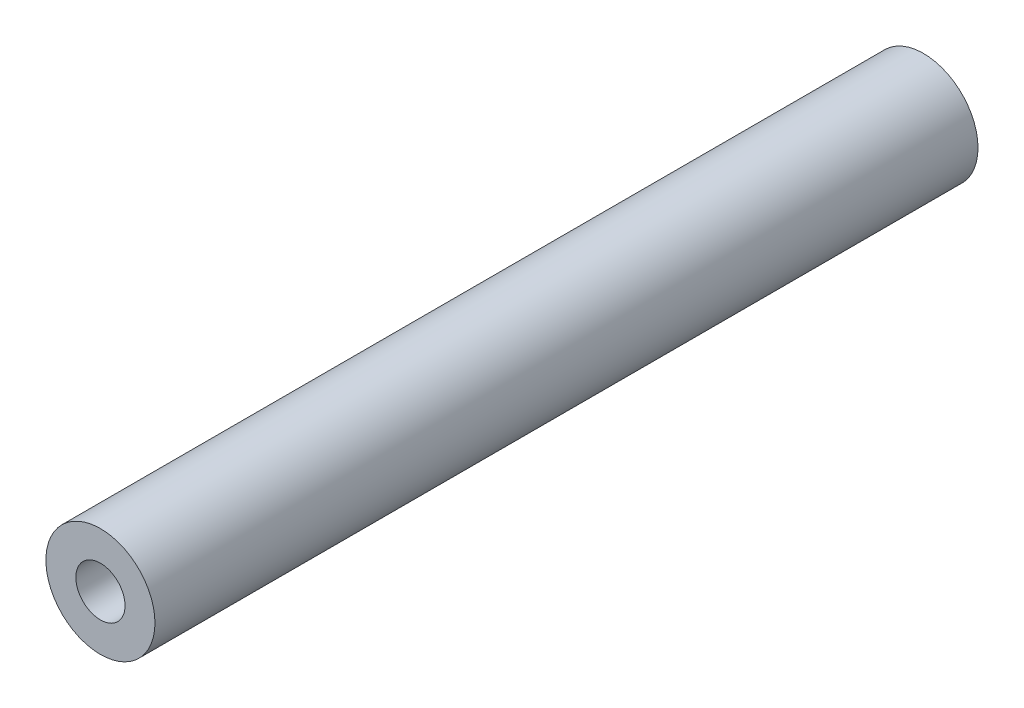
ISO-10303-21;
HEADER;
FILE_DESCRIPTION(('STEP AP214'),'2;1');
FILE_NAME('part.step','',(''),(''),'','','');
FILE_SCHEMA(('AUTOMOTIVE_DESIGN { 1 0 10303 214 1 1 1 1 }'));
ENDSEC;
DATA;
#1=APPLICATION_CONTEXT('core data for automotive mechanical design processes');
#2=APPLICATION_PROTOCOL_DEFINITION('international standard','automotive_design',2000,#1);
#3=PRODUCT_CONTEXT('',#1,'mechanical');
#4=PRODUCT('Part','Part','',(#3));
#5=PRODUCT_RELATED_PRODUCT_CATEGORY('part','',(#4));
#6=PRODUCT_DEFINITION_FORMATION('','',#4);
#7=PRODUCT_DEFINITION_CONTEXT('part definition',#1,'design');
#8=PRODUCT_DEFINITION('design','',#6,#7);
#9=PRODUCT_DEFINITION_SHAPE('','',#8);
#10=(LENGTH_UNIT() NAMED_UNIT(*) SI_UNIT(.MILLI.,.METRE.));
#11=(NAMED_UNIT(*) PLANE_ANGLE_UNIT() SI_UNIT($,.RADIAN.));
#12=(NAMED_UNIT(*) SI_UNIT($,.STERADIAN.) SOLID_ANGLE_UNIT());
#13=UNCERTAINTY_MEASURE_WITH_UNIT(LENGTH_MEASURE(1.E-05),#10,'distance_accuracy_value','');
#14=(GEOMETRIC_REPRESENTATION_CONTEXT(3) GLOBAL_UNCERTAINTY_ASSIGNED_CONTEXT((#13)) GLOBAL_UNIT_ASSIGNED_CONTEXT((#10,
#11,#12)) REPRESENTATION_CONTEXT('',''));
#15=CARTESIAN_POINT('',(0.,0.,0.));
#16=DIRECTION('',(0.,0.,1.));
#17=DIRECTION('',(1.,0.,0.));
#18=AXIS2_PLACEMENT_3D('',#15,#16,#17);
#19=CARTESIAN_POINT('',(0.,0.,45.28));
#20=DIRECTION('',(0.,0.,-1.));
#21=DIRECTION('',(-1.,0.,0.));
#22=AXIS2_PLACEMENT_3D('',#19,#20,#21);
#23=CYLINDRICAL_SURFACE('',#22,3.);
#24=CARTESIAN_POINT('',(0.,0.,45.28));
#25=DIRECTION('',(0.,0.,1.));
#26=DIRECTION('',(1.,0.,0.));
#27=AXIS2_PLACEMENT_3D('',#24,#25,#26);
#28=CIRCLE('',#27,3.);
#29=CARTESIAN_POINT('',(3.,0.,45.28));
#30=VERTEX_POINT('',#29);
#31=EDGE_CURVE('E11',#30,#30,#28,.T.);
#32=ORIENTED_EDGE('',*,*,#31,.F.);
#33=EDGE_LOOP('',(#32));
#34=FACE_BOUND('',#33,.T.);
#35=CARTESIAN_POINT('',(0.,0.,0.));
#36=DIRECTION('',(0.,0.,1.));
#37=DIRECTION('',(1.,0.,0.));
#38=AXIS2_PLACEMENT_3D('',#35,#36,#37);
#39=CIRCLE('',#38,3.);
#40=CARTESIAN_POINT('',(3.,0.,0.));
#41=VERTEX_POINT('',#40);
#42=EDGE_CURVE('E39',#41,#41,#39,.T.);
#43=ORIENTED_EDGE('',*,*,#42,.T.);
#44=EDGE_LOOP('',(#43));
#45=FACE_BOUND('',#44,.T.);
#46=ADVANCED_FACE('F36',(#34,#45),#23,.T.);
#47=CARTESIAN_POINT('',(0.,0.,45.28));
#48=DIRECTION('',(0.,0.,1.));
#49=DIRECTION('',(1.,0.,0.));
#50=AXIS2_PLACEMENT_3D('',#47,#48,#49);
#51=PLANE('',#50);
#52=CARTESIAN_POINT('',(0.,0.,45.28));
#53=DIRECTION('',(0.,0.,1.));
#54=DIRECTION('',(1.,0.,0.));
#55=AXIS2_PLACEMENT_3D('',#52,#53,#54);
#56=CIRCLE('',#55,1.35254999999999);
#57=CARTESIAN_POINT('',(1.35254999999999,0.,45.28));
#58=VERTEX_POINT('',#57);
#59=EDGE_CURVE('E59',#58,#58,#56,.T.);
#60=ORIENTED_EDGE('',*,*,#59,.F.);
#61=EDGE_LOOP('',(#60));
#62=FACE_BOUND('',#61,.T.);
#63=ORIENTED_EDGE('',*,*,#31,.T.);
#64=EDGE_LOOP('',(#63));
#65=FACE_BOUND('',#64,.T.);
#66=ADVANCED_FACE('F78',(#62,#65),#51,.T.);
#67=CARTESIAN_POINT('',(0.,0.,0.));
#68=DIRECTION('',(0.,0.,1.));
#69=DIRECTION('',(1.,0.,0.));
#70=AXIS2_PLACEMENT_3D('',#67,#68,#69);
#71=PLANE('',#70);
#72=CARTESIAN_POINT('',(0.,0.,0.));
#73=DIRECTION('',(0.,0.,-1.));
#74=DIRECTION('',(-1.,0.,0.));
#75=AXIS2_PLACEMENT_3D('',#72,#73,#74);
#76=CIRCLE('',#75,1.35254999999999);
#77=CARTESIAN_POINT('',(-1.35254999999999,0.,0.));
#78=VERTEX_POINT('',#77);
#79=EDGE_CURVE('E60',#78,#78,#76,.T.);
#80=ORIENTED_EDGE('',*,*,#79,.F.);
#81=EDGE_LOOP('',(#80));
#82=FACE_BOUND('',#81,.T.);
#83=ORIENTED_EDGE('',*,*,#42,.F.);
#84=EDGE_LOOP('',(#83));
#85=FACE_BOUND('',#84,.T.);
#86=ADVANCED_FACE('F75',(#82,#85),#71,.F.);
#87=CARTESIAN_POINT('',(0.,0.,35.28));
#88=DIRECTION('',(0.,0.,1.));
#89=DIRECTION('',(1.,0.,0.));
#90=AXIS2_PLACEMENT_3D('',#87,#88,#89);
#91=CONICAL_SURFACE('',#90,1.35254999999999,1.02974425867665);
#92=CARTESIAN_POINT('',(0.,0.,34.4673059697343));
#93=VERTEX_POINT('',#92);
#94=VERTEX_LOOP('',#93);
#95=FACE_BOUND('',#94,.T.);
#96=CARTESIAN_POINT('',(0.,0.,35.28));
#97=DIRECTION('',(0.,0.,1.));
#98=DIRECTION('',(1.,0.,0.));
#99=AXIS2_PLACEMENT_3D('',#96,#97,#98);
#100=CIRCLE('',#99,1.35254999999999);
#101=CARTESIAN_POINT('',(1.35254999999999,0.,35.28));
#102=VERTEX_POINT('',#101);
#103=EDGE_CURVE('E63',#102,#102,#100,.T.);
#104=ORIENTED_EDGE('',*,*,#103,.T.);
#105=EDGE_LOOP('',(#104));
#106=FACE_BOUND('',#105,.T.);
#107=ADVANCED_FACE('F77',(#95,#106),#91,.F.);
#108=CARTESIAN_POINT('',(0.,0.,45.28));
#109=DIRECTION('',(0.,0.,1.));
#110=DIRECTION('',(1.,0.,0.));
#111=AXIS2_PLACEMENT_3D('',#108,#109,#110);
#112=CYLINDRICAL_SURFACE('',#111,1.35254999999999);
#113=ORIENTED_EDGE('',*,*,#103,.F.);
#114=EDGE_LOOP('',(#113));
#115=FACE_BOUND('',#114,.T.);
#116=ORIENTED_EDGE('',*,*,#59,.T.);
#117=EDGE_LOOP('',(#116));
#118=FACE_BOUND('',#117,.T.);
#119=ADVANCED_FACE('F53',(#115,#118),#112,.F.);
#120=CARTESIAN_POINT('',(0.,0.,9.99999999999999));
#121=DIRECTION('',(0.,0.,-1.));
#122=DIRECTION('',(-1.,0.,0.));
#123=AXIS2_PLACEMENT_3D('',#120,#121,#122);
#124=CONICAL_SURFACE('',#123,1.35254999999999,1.02974425867665);
#125=CARTESIAN_POINT('',(0.,0.,10.8126940302657));
#126=VERTEX_POINT('',#125);
#127=VERTEX_LOOP('',#126);
#128=FACE_BOUND('',#127,.T.);
#129=CARTESIAN_POINT('',(0.,0.,9.99999999999999));
#130=DIRECTION('',(0.,0.,-1.));
#131=DIRECTION('',(-1.,0.,0.));
#132=AXIS2_PLACEMENT_3D('',#129,#130,#131);
#133=CIRCLE('',#132,1.35254999999999);
#134=CARTESIAN_POINT('',(-1.35254999999999,0.,9.99999999999999));
#135=VERTEX_POINT('',#134);
#136=EDGE_CURVE('E57',#135,#135,#133,.T.);
#137=ORIENTED_EDGE('',*,*,#136,.T.);
#138=EDGE_LOOP('',(#137));
#139=FACE_BOUND('',#138,.T.);
#140=ADVANCED_FACE('F49',(#128,#139),#124,.F.);
#141=CARTESIAN_POINT('',(0.,0.,0.));
#142=DIRECTION('',(0.,0.,-1.));
#143=DIRECTION('',(-1.,0.,0.));
#144=AXIS2_PLACEMENT_3D('',#141,#142,#143);
#145=CYLINDRICAL_SURFACE('',#144,1.35254999999999);
#146=ORIENTED_EDGE('',*,*,#136,.F.);
#147=EDGE_LOOP('',(#146));
#148=FACE_BOUND('',#147,.T.);
#149=ORIENTED_EDGE('',*,*,#79,.T.);
#150=EDGE_LOOP('',(#149));
#151=FACE_BOUND('',#150,.T.);
#152=ADVANCED_FACE('F52',(#148,#151),#145,.F.);
#153=CLOSED_SHELL('',(#46,#66,#86,#107,#119,#140,#152));
#154=MANIFOLD_SOLID_BREP('B2',#153);
#155=ADVANCED_BREP_SHAPE_REPRESENTATION('',(#18,#154),#14);
#156=SHAPE_DEFINITION_REPRESENTATION(#9,#155);
ENDSEC;
END-ISO-10303-21;
